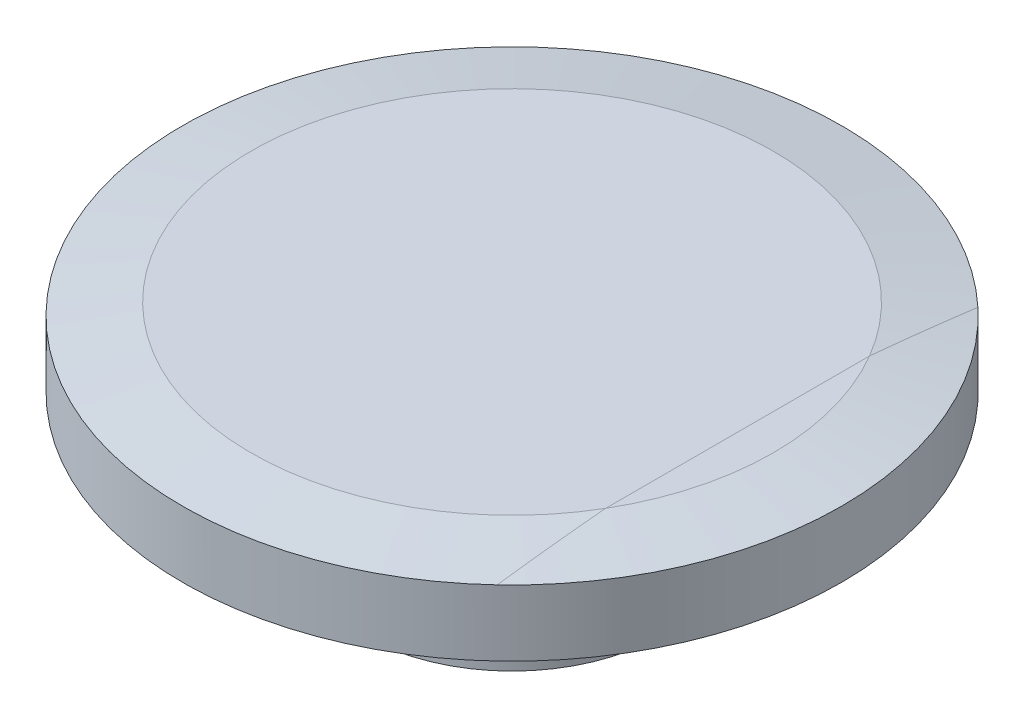
ISO-10303-21;
HEADER;
FILE_DESCRIPTION(('STEP AP214'),'2;1');
FILE_NAME('part.step','',(''),(''),'','','');
FILE_SCHEMA(('AUTOMOTIVE_DESIGN { 1 0 10303 214 1 1 1 1 }'));
ENDSEC;
DATA;
#1=APPLICATION_CONTEXT('core data for automotive mechanical design processes');
#2=APPLICATION_PROTOCOL_DEFINITION('international standard','automotive_design',2000,#1);
#3=PRODUCT_CONTEXT('',#1,'mechanical');
#4=PRODUCT('Part','Part','',(#3));
#5=PRODUCT_RELATED_PRODUCT_CATEGORY('part','',(#4));
#6=PRODUCT_DEFINITION_FORMATION('','',#4);
#7=PRODUCT_DEFINITION_CONTEXT('part definition',#1,'design');
#8=PRODUCT_DEFINITION('design','',#6,#7);
#9=PRODUCT_DEFINITION_SHAPE('','',#8);
#10=(LENGTH_UNIT() NAMED_UNIT(*) SI_UNIT(.MILLI.,.METRE.));
#11=(NAMED_UNIT(*) PLANE_ANGLE_UNIT() SI_UNIT($,.RADIAN.));
#12=(NAMED_UNIT(*) SI_UNIT($,.STERADIAN.) SOLID_ANGLE_UNIT());
#13=UNCERTAINTY_MEASURE_WITH_UNIT(LENGTH_MEASURE(1.E-05),#10,'distance_accuracy_value','');
#14=(GEOMETRIC_REPRESENTATION_CONTEXT(3) GLOBAL_UNCERTAINTY_ASSIGNED_CONTEXT((#13)) GLOBAL_UNIT_ASSIGNED_CONTEXT((#10,
#11,#12)) REPRESENTATION_CONTEXT('',''));
#15=CARTESIAN_POINT('',(0.,0.,0.));
#16=DIRECTION('',(0.,0.,1.));
#17=DIRECTION('',(1.,0.,0.));
#18=AXIS2_PLACEMENT_3D('',#15,#16,#17);
#19=CARTESIAN_POINT('',(0.,4.80540728933231,0.));
#20=DIRECTION('',(0.,-1.,0.));
#21=DIRECTION('',(1.,0.,0.));
#22=AXIS2_PLACEMENT_3D('',#19,#20,#21);
#23=CONICAL_SURFACE('',#22,19.,1.39626340159547);
#24=CARTESIAN_POINT('',(0.,4.80540728933231,0.));
#25=DIRECTION('',(0.,-1.,0.));
#26=DIRECTION('',(1.,0.,0.));
#27=AXIS2_PLACEMENT_3D('',#24,#25,#26);
#28=CIRCLE('',#27,19.);
#29=CARTESIAN_POINT('',(13.,4.80540728933231,13.856406460551));
#30=VERTEX_POINT('',#29);
#31=CARTESIAN_POINT('',(13.,4.80540728933231,-13.856406460551));
#32=VERTEX_POINT('',#31);
#33=EDGE_CURVE('E99',#30,#32,#28,.T.);
#34=ORIENTED_EDGE('',*,*,#33,.F.);
#35=CARTESIAN_POINT('',(13.,2.31121008987516,30.4895161654745));
#36=CARTESIAN_POINT('',(13.,2.41530572681389,29.8476905336172));
#37=CARTESIAN_POINT('',(13.,2.51892307689922,29.2057869232764));
#38=CARTESIAN_POINT('',(13.,2.7249923543946,27.9217911718034));
#39=CARTESIAN_POINT('',(13.,2.8274442790501,27.2796990302292));
#40=CARTESIAN_POINT('',(13.,3.0309776594264,25.9952695608044));
#41=CARTESIAN_POINT('',(13.,3.13205905710125,25.3529322237462));
#42=CARTESIAN_POINT('',(13.,3.33257228938226,24.0680001913044));
#43=CARTESIAN_POINT('',(13.,3.43200412475887,23.4254054960411));
#44=CARTESIAN_POINT('',(13.,3.62949258321327,22.135886040919));
#45=CARTESIAN_POINT('',(13.,3.72753669671665,21.4889593626281));
#46=CARTESIAN_POINT('',(13.,3.92116463128853,20.1947380838925));
#47=CARTESIAN_POINT('',(13.,4.01674845535077,19.5474434838964));
#48=CARTESIAN_POINT('',(13.,4.20488870255473,18.2524125259976));
#49=CARTESIAN_POINT('',(13.,4.29744512140502,17.60467616747));
#50=CARTESIAN_POINT('',(13.,4.47880115270545,16.3086758796796));
#51=CARTESIAN_POINT('',(13.,4.56760076392919,15.6604119502447));
#52=CARTESIAN_POINT('',(13.,4.73921553340661,14.3729191267315));
#53=CARTESIAN_POINT('',(13.,4.82210014398257,13.7336995266951));
#54=CARTESIAN_POINT('',(13.,4.98216288450543,12.4545416986967));
#55=CARTESIAN_POINT('',(13.,5.05934100838971,11.8146034699719));
#56=CARTESIAN_POINT('',(13.,5.20654855000325,10.5338495345427));
#57=CARTESIAN_POINT('',(13.,5.2765774184768,9.89303376424635));
#58=CARTESIAN_POINT('',(13.,5.40770408354041,8.61047919203078));
#59=CARTESIAN_POINT('',(13.,5.46880186787379,7.96874038884602));
#60=CARTESIAN_POINT('',(13.,5.57981104415224,6.68643607556364));
#61=CARTESIAN_POINT('',(13.,5.6297589989125,6.04587377159681));
#62=CARTESIAN_POINT('',(13.,5.71653622670032,4.76386474126163));
#63=CARTESIAN_POINT('',(13.,5.75336587281951,4.12241804056692));
#64=CARTESIAN_POINT('',(13.,5.81188953804813,2.83898342444468));
#65=CARTESIAN_POINT('',(13.,5.83358738757517,2.19699568720111));
#66=CARTESIAN_POINT('',(13.,5.86047721364373,0.912673419967473));
#67=CARTESIAN_POINT('',(13.,5.86566935821499,0.270338893574328));
#68=CARTESIAN_POINT('',(13.,5.85926983447491,-0.998977350105742));
#69=CARTESIAN_POINT('',(13.,5.84807415398916,-1.62596110371076));
#70=CARTESIAN_POINT('',(13.,5.81034202725848,-2.87945760004487));
#71=CARTESIAN_POINT('',(13.,5.78380543290066,-3.50597033816794));
#72=CARTESIAN_POINT('',(13.,5.68345304369718,-5.38469318401634));
#73=CARTESIAN_POINT('',(13.,5.58889721893067,-6.63580943363815));
#74=CARTESIAN_POINT('',(13.,5.41737986608787,-8.51164386407171));
#75=CARTESIAN_POINT('',(13.,5.35513167163209,-9.13782352486299));
#76=CARTESIAN_POINT('',(13.,5.22260595965362,-10.3893424884137));
#77=CARTESIAN_POINT('',(13.,5.15232845285552,-11.0146817922944));
#78=CARTESIAN_POINT('',(13.,5.00532255772142,-12.264532290718));
#79=CARTESIAN_POINT('',(13.,4.92859477672202,-12.8890435576143));
#80=CARTESIAN_POINT('',(13.,4.76996254968886,-14.137405838054));
#81=CARTESIAN_POINT('',(13.,4.68805810816821,-14.7612568521726));
#82=CARTESIAN_POINT('',(13.,4.51884903433383,-16.017605324806));
#83=CARTESIAN_POINT('',(13.,4.43148251406547,-16.6500944133672));
#84=CARTESIAN_POINT('',(13.,4.25330033589122,-17.9145851118954));
#85=CARTESIAN_POINT('',(13.,4.16248467888602,-18.5465867219897));
#86=CARTESIAN_POINT('',(13.,3.9780548832446,-19.8101874123));
#87=CARTESIAN_POINT('',(13.,3.88444071511186,-20.4417864882017));
#88=CARTESIAN_POINT('',(13.,3.69492504435202,-21.704641526758));
#89=CARTESIAN_POINT('',(13.,3.59902353927255,-22.3358974890441));
#90=CARTESIAN_POINT('',(13.,3.40591084898618,-23.5943666770609));
#91=CARTESIAN_POINT('',(13.,3.3087108434296,-24.2215816204942));
#92=CARTESIAN_POINT('',(13.,3.11275957106311,-25.4757691975206));
#93=CARTESIAN_POINT('',(13.,3.01400830358431,-26.1027418310091));
#94=CARTESIAN_POINT('',(13.,2.81521143747229,-27.3564498902704));
#95=CARTESIAN_POINT('',(13.,2.71516590306829,-27.9831853262378));
#96=CARTESIAN_POINT('',(13.,2.51396907830428,-29.2364773597436));
#97=CARTESIAN_POINT('',(13.,2.41281779032627,-29.8630339576643));
#98=CARTESIAN_POINT('',(13.,2.31121008987516,-30.4895161654745));
#99=B_SPLINE_CURVE_WITH_KNOTS('',3,(#35,#36,#37,#38,#39,#40,#41,#42,#43,#44,#45,#46,#47,#48,#49,
#50,#51,#52,#53,#54,#55,#56,#57,#58,#59,#60,#61,#62,#63,#64,#65,#66,#67,#68,#69,#70,#71,#72,#73,
#74,#75,#76,#77,#78,#79,#80,#81,#82,#83,#84,#85,#86,#87,#88,#89,#90,#91,#92,#93,#94,#95,#96,#97,
#98),.UNSPECIFIED.,.F.,.F.,(4,2,2,2,2,2,2,2,2,2,2,2,2,2,2,2,2,2,2,2,2,2,2,2,2,2,2,2,2,2,2,4),
(0.,1.95063733751736,3.90127928453466,5.85200359067993,7.80272698570069,9.76566507352978,
11.7286007726886,13.6915392542314,15.6544783765623,17.5881706616603,19.5218650010976,
21.4557077888106,23.3895532304317,25.3169608260723,27.2443136008445,29.1711783140514,
31.0980234115189,32.9790708706674,34.8601364911848,38.6231024232312,40.5108799595391,
42.3986549744106,44.2862524412546,46.1738482624777,48.0893205989275,50.0047924351898,
51.9202844677934,53.8357785541836,55.7398817816886,57.6439858302507,59.5479957455857,
61.4520015601429),.UNSPECIFIED.);
#100=CARTESIAN_POINT('',(13.,5.5,7.60439100181148));
#101=VERTEX_POINT('',#100);
#102=EDGE_CURVE('E12',#30,#101,#99,.T.);
#103=ORIENTED_EDGE('',*,*,#102,.T.);
#104=CARTESIAN_POINT('',(0.,5.5,0.));
#105=DIRECTION('',(0.,-1.,0.));
#106=DIRECTION('',(1.,0.,0.));
#107=AXIS2_PLACEMENT_3D('',#104,#105,#106);
#108=CIRCLE('',#107,15.0607689879512);
#109=CARTESIAN_POINT('',(13.,5.5,-7.60439100181148));
#110=VERTEX_POINT('',#109);
#111=EDGE_CURVE('E97',#101,#110,#108,.T.);
#112=ORIENTED_EDGE('',*,*,#111,.T.);
#113=EDGE_CURVE('E79',#110,#32,#99,.T.);
#114=ORIENTED_EDGE('',*,*,#113,.T.);
#115=EDGE_LOOP('',(#34,#103,#112,#114));
#116=FACE_BOUND('',#115,.T.);
#117=ADVANCED_FACE('F68',(#116),#23,.T.);
#118=CARTESIAN_POINT('',(0.,5.5,0.));
#119=DIRECTION('',(0.,-1.,0.));
#120=DIRECTION('',(1.,0.,0.));
#121=AXIS2_PLACEMENT_3D('',#118,#119,#120);
#122=PLANE('',#121);
#123=DIRECTION('',(0.,0.,1.));
#124=VECTOR('',#123,1.);
#125=CARTESIAN_POINT('',(13.,5.5,0.));
#126=LINE('',#125,#124);
#127=EDGE_CURVE('E72',#110,#101,#126,.T.);
#128=ORIENTED_EDGE('',*,*,#127,.F.);
#129=ORIENTED_EDGE('',*,*,#111,.F.);
#130=EDGE_LOOP('',(#128,#129));
#131=FACE_BOUND('',#130,.T.);
#132=ADVANCED_FACE('F111',(#131),#122,.F.);
#133=EDGE_CURVE('E104',#110,#101,#108,.T.);
#134=ORIENTED_EDGE('',*,*,#133,.F.);
#135=ORIENTED_EDGE('',*,*,#127,.T.);
#136=EDGE_LOOP('',(#134,#135));
#137=FACE_BOUND('',#136,.T.);
#138=ADVANCED_FACE('F103',(#137),#122,.F.);
#139=ORIENTED_EDGE('',*,*,#102,.F.);
#140=EDGE_CURVE('E113',#32,#30,#28,.T.);
#141=ORIENTED_EDGE('',*,*,#140,.F.);
#142=ORIENTED_EDGE('',*,*,#113,.F.);
#143=ORIENTED_EDGE('',*,*,#133,.T.);
#144=EDGE_LOOP('',(#139,#141,#142,#143));
#145=FACE_BOUND('',#144,.T.);
#146=ADVANCED_FACE('F107',(#145),#23,.T.);
#147=CARTESIAN_POINT('',(0.,-1.6,0.));
#148=DIRECTION('',(0.,-1.,0.));
#149=DIRECTION('',(1.,0.,0.));
#150=AXIS2_PLACEMENT_3D('',#147,#148,#149);
#151=CYLINDRICAL_SURFACE('',#150,19.);
#152=ORIENTED_EDGE('',*,*,#33,.T.);
#153=ORIENTED_EDGE('',*,*,#140,.T.);
#154=EDGE_LOOP('',(#152,#153));
#155=FACE_BOUND('',#154,.T.);
#156=CARTESIAN_POINT('',(0.,0.999999999999999,0.));
#157=DIRECTION('',(0.,-1.,0.));
#158=DIRECTION('',(1.,0.,0.));
#159=AXIS2_PLACEMENT_3D('',#156,#157,#158);
#160=CIRCLE('',#159,19.);
#161=CARTESIAN_POINT('',(19.,0.999999999999999,0.));
#162=VERTEX_POINT('',#161);
#163=EDGE_CURVE('E211',#162,#162,#160,.F.);
#164=ORIENTED_EDGE('',*,*,#163,.T.);
#165=EDGE_LOOP('',(#164));
#166=FACE_BOUND('',#165,.T.);
#167=ADVANCED_FACE('F130',(#155,#166),#151,.T.);
#168=CARTESIAN_POINT('',(0.,3.4,0.));
#169=DIRECTION('',(0.,1.,0.));
#170=DIRECTION('',(-1.,0.,0.));
#171=AXIS2_PLACEMENT_3D('',#168,#169,#170);
#172=PLANE('',#171);
#173=CARTESIAN_POINT('',(0.,3.4,0.));
#174=DIRECTION('',(0.,-1.,0.));
#175=DIRECTION('',(1.,0.,0.));
#176=AXIS2_PLACEMENT_3D('',#173,#174,#175);
#177=CIRCLE('',#176,5.6);
#178=CARTESIAN_POINT('',(5.6,3.4,0.));
#179=VERTEX_POINT('',#178);
#180=EDGE_CURVE('E234',#179,#179,#177,.T.);
#181=ORIENTED_EDGE('',*,*,#180,.T.);
#182=EDGE_LOOP('',(#181));
#183=FACE_BOUND('',#182,.T.);
#184=ADVANCED_FACE('F139',(#183),#172,.F.);
#185=CARTESIAN_POINT('',(0.,-1.6,0.));
#186=DIRECTION('',(0.,-1.,0.));
#187=DIRECTION('',(1.,0.,0.));
#188=AXIS2_PLACEMENT_3D('',#185,#186,#187);
#189=CYLINDRICAL_SURFACE('',#188,5.6);
#190=ORIENTED_EDGE('',*,*,#180,.F.);
#191=EDGE_LOOP('',(#190));
#192=FACE_BOUND('',#191,.T.);
#193=CARTESIAN_POINT('',(0.,-6.85,0.));
#194=DIRECTION('',(0.,1.,0.));
#195=DIRECTION('',(-1.,0.,0.));
#196=AXIS2_PLACEMENT_3D('',#193,#194,#195);
#197=CIRCLE('',#196,5.6);
#198=CARTESIAN_POINT('',(-5.6,-6.85,0.));
#199=VERTEX_POINT('',#198);
#200=EDGE_CURVE('E237',#199,#199,#197,.T.);
#201=ORIENTED_EDGE('',*,*,#200,.F.);
#202=EDGE_LOOP('',(#201));
#203=FACE_BOUND('',#202,.T.);
#204=ADVANCED_FACE('F145',(#192,#203),#189,.F.);
#205=CARTESIAN_POINT('',(0.,-6.85,0.));
#206=DIRECTION('',(0.,1.,0.));
#207=DIRECTION('',(-1.,0.,0.));
#208=AXIS2_PLACEMENT_3D('',#205,#206,#207);
#209=PLANE('',#208);
#210=CARTESIAN_POINT('',(0.,-6.85,0.));
#211=DIRECTION('',(0.,1.,0.));
#212=DIRECTION('',(-1.,0.,0.));
#213=AXIS2_PLACEMENT_3D('',#210,#211,#212);
#214=CIRCLE('',#213,8.6);
#215=CARTESIAN_POINT('',(-8.6,-6.85,0.));
#216=VERTEX_POINT('',#215);
#217=EDGE_CURVE('E117',#216,#216,#214,.T.);
#218=ORIENTED_EDGE('',*,*,#217,.F.);
#219=EDGE_LOOP('',(#218));
#220=FACE_BOUND('',#219,.T.);
#221=ORIENTED_EDGE('',*,*,#200,.T.);
#222=EDGE_LOOP('',(#221));
#223=FACE_BOUND('',#222,.T.);
#224=ADVANCED_FACE('F149',(#220,#223),#209,.F.);
#225=CARTESIAN_POINT('',(0.,-1.6,0.));
#226=DIRECTION('',(0.,-1.,0.));
#227=DIRECTION('',(1.,0.,0.));
#228=AXIS2_PLACEMENT_3D('',#225,#226,#227);
#229=CYLINDRICAL_SURFACE('',#228,8.6);
#230=CARTESIAN_POINT('',(0.,-0.350000000000001,0.));
#231=DIRECTION('',(0.,-1.,0.));
#232=DIRECTION('',(1.,0.,0.));
#233=AXIS2_PLACEMENT_3D('',#230,#231,#232);
#234=CIRCLE('',#233,8.6);
#235=CARTESIAN_POINT('',(8.6,-0.350000000000001,0.));
#236=VERTEX_POINT('',#235);
#237=EDGE_CURVE('E230',#236,#236,#234,.T.);
#238=ORIENTED_EDGE('',*,*,#237,.T.);
#239=EDGE_LOOP('',(#238));
#240=FACE_BOUND('',#239,.T.);
#241=ORIENTED_EDGE('',*,*,#217,.T.);
#242=EDGE_LOOP('',(#241));
#243=FACE_BOUND('',#242,.T.);
#244=ADVANCED_FACE('F153',(#240,#243),#229,.T.);
#245=CARTESIAN_POINT('',(0.,-0.350000000000001,0.));
#246=DIRECTION('',(0.,1.,0.));
#247=DIRECTION('',(-1.,0.,0.));
#248=AXIS2_PLACEMENT_3D('',#245,#246,#247);
#249=PLANE('',#248);
#250=ORIENTED_EDGE('',*,*,#237,.F.);
#251=EDGE_LOOP('',(#250));
#252=FACE_BOUND('',#251,.T.);
#253=CARTESIAN_POINT('',(0.,-0.350000000000001,0.));
#254=DIRECTION('',(0.,-1.,0.));
#255=DIRECTION('',(1.,0.,0.));
#256=AXIS2_PLACEMENT_3D('',#253,#254,#255);
#257=CIRCLE('',#256,10.35);
#258=CARTESIAN_POINT('',(10.35,-0.350000000000001,0.));
#259=VERTEX_POINT('',#258);
#260=EDGE_CURVE('E226',#259,#259,#257,.T.);
#261=ORIENTED_EDGE('',*,*,#260,.T.);
#262=EDGE_LOOP('',(#261));
#263=FACE_BOUND('',#262,.T.);
#264=ADVANCED_FACE('F157',(#252,#263),#249,.F.);
#265=CARTESIAN_POINT('',(0.,-1.6,0.));
#266=DIRECTION('',(0.,-1.,0.));
#267=DIRECTION('',(1.,0.,0.));
#268=AXIS2_PLACEMENT_3D('',#265,#266,#267);
#269=CYLINDRICAL_SURFACE('',#268,10.35);
#270=ORIENTED_EDGE('',*,*,#260,.F.);
#271=EDGE_LOOP('',(#270));
#272=FACE_BOUND('',#271,.T.);
#273=CARTESIAN_POINT('',(0.,0.,0.));
#274=DIRECTION('',(0.,-1.,0.));
#275=DIRECTION('',(1.,0.,0.));
#276=AXIS2_PLACEMENT_3D('',#273,#274,#275);
#277=CIRCLE('',#276,10.35);
#278=CARTESIAN_POINT('',(10.35,0.,0.));
#279=VERTEX_POINT('',#278);
#280=EDGE_CURVE('E222',#279,#279,#277,.T.);
#281=ORIENTED_EDGE('',*,*,#280,.T.);
#282=EDGE_LOOP('',(#281));
#283=FACE_BOUND('',#282,.T.);
#284=ADVANCED_FACE('F161',(#272,#283),#269,.T.);
#285=CARTESIAN_POINT('',(0.,0.,0.));
#286=DIRECTION('',(0.,-1.,0.));
#287=DIRECTION('',(1.,0.,0.));
#288=AXIS2_PLACEMENT_3D('',#285,#286,#287);
#289=PLANE('',#288);
#290=CARTESIAN_POINT('',(0.,0.,0.));
#291=DIRECTION('',(0.,-1.,0.));
#292=DIRECTION('',(1.,0.,0.));
#293=AXIS2_PLACEMENT_3D('',#290,#291,#292);
#294=CIRCLE('',#293,10.8556535720254);
#295=CARTESIAN_POINT('',(10.8556535720254,0.,0.));
#296=VERTEX_POINT('',#295);
#297=EDGE_CURVE('E218',#296,#296,#294,.T.);
#298=ORIENTED_EDGE('',*,*,#297,.T.);
#299=EDGE_LOOP('',(#298));
#300=FACE_BOUND('',#299,.T.);
#301=ORIENTED_EDGE('',*,*,#280,.F.);
#302=EDGE_LOOP('',(#301));
#303=FACE_BOUND('',#302,.T.);
#304=ADVANCED_FACE('F165',(#300,#303),#289,.T.);
#305=CARTESIAN_POINT('',(0.,0.,0.));
#306=DIRECTION('',(0.,1.,0.));
#307=DIRECTION('',(-1.,0.,0.));
#308=AXIS2_PLACEMENT_3D('',#305,#306,#307);
#309=CONICAL_SURFACE('',#308,10.8556535720254,1.44862327915529);
#310=ORIENTED_EDGE('',*,*,#163,.F.);
#311=EDGE_LOOP('',(#310));
#312=FACE_BOUND('',#311,.T.);
#313=ORIENTED_EDGE('',*,*,#297,.F.);
#314=EDGE_LOOP('',(#313));
#315=FACE_BOUND('',#314,.T.);
#316=ADVANCED_FACE('F169',(#312,#315),#309,.T.);
#317=CLOSED_SHELL('',(#117,#132,#138,#146,#167,#184,#204,#224,#244,#264,#284,#304,#316));
#318=CARTESIAN_POINT('',(0.,1.2,0.));
#319=DIRECTION('',(0.,-1.,0.));
#320=DIRECTION('',(1.,0.,0.));
#321=AXIS2_PLACEMENT_3D('',#318,#319,#320);
#322=PLANE('',#321);
#323=CARTESIAN_POINT('',(0.,1.2,0.));
#324=DIRECTION('',(0.,-1.,0.));
#325=DIRECTION('',(1.,0.,0.));
#326=AXIS2_PLACEMENT_3D('',#323,#324,#325);
#327=CIRCLE('',#326,10.7822584278448);
#328=CARTESIAN_POINT('',(10.7822584278448,1.2,0.));
#329=VERTEX_POINT('',#328);
#330=EDGE_CURVE('E207',#329,#329,#327,.T.);
#331=ORIENTED_EDGE('',*,*,#330,.F.);
#332=EDGE_LOOP('',(#331));
#333=FACE_BOUND('',#332,.T.);
#334=CARTESIAN_POINT('',(0.,1.2,0.));
#335=DIRECTION('',(0.,-1.,0.));
#336=DIRECTION('',(1.,0.,0.));
#337=AXIS2_PLACEMENT_3D('',#334,#335,#336);
#338=CIRCLE('',#337,7.15);
#339=CARTESIAN_POINT('',(7.15,1.2,0.));
#340=VERTEX_POINT('',#339);
#341=EDGE_CURVE('E195',#340,#340,#338,.T.);
#342=ORIENTED_EDGE('',*,*,#341,.T.);
#343=EDGE_LOOP('',(#342));
#344=FACE_BOUND('',#343,.T.);
#345=ADVANCED_FACE('F185',(#333,#344),#322,.F.);
#346=CARTESIAN_POINT('',(0.,-1.6,0.));
#347=DIRECTION('',(0.,-1.,0.));
#348=DIRECTION('',(1.,0.,0.));
#349=AXIS2_PLACEMENT_3D('',#346,#347,#348);
#350=CYLINDRICAL_SURFACE('',#349,7.15);
#351=ORIENTED_EDGE('',*,*,#341,.F.);
#352=EDGE_LOOP('',(#351));
#353=FACE_BOUND('',#352,.T.);
#354=CARTESIAN_POINT('',(0.,4.3,0.));
#355=DIRECTION('',(0.,1.,0.));
#356=DIRECTION('',(-1.,0.,0.));
#357=AXIS2_PLACEMENT_3D('',#354,#355,#356);
#358=CIRCLE('',#357,7.15);
#359=CARTESIAN_POINT('',(-7.15,4.3,0.));
#360=VERTEX_POINT('',#359);
#361=EDGE_CURVE('E109',#360,#360,#358,.F.);
#362=ORIENTED_EDGE('',*,*,#361,.T.);
#363=EDGE_LOOP('',(#362));
#364=FACE_BOUND('',#363,.T.);
#365=ADVANCED_FACE('F183',(#353,#364),#350,.T.);
#366=CARTESIAN_POINT('',(0.,1.19105538196959,0.));
#367=DIRECTION('',(0.,1.,0.));
#368=DIRECTION('',(-1.,0.,0.));
#369=AXIS2_PLACEMENT_3D('',#366,#367,#368);
#370=CONICAL_SURFACE('',#369,10.7094103599392,1.44862327915529);
#371=CARTESIAN_POINT('',(0.,2.06167031746713,0.));
#372=DIRECTION('',(0.,1.,0.));
#373=DIRECTION('',(-1.,0.,0.));
#374=AXIS2_PLACEMENT_3D('',#371,#372,#373);
#375=CIRCLE('',#374,17.8);
#376=CARTESIAN_POINT('',(-17.8,2.06167031746713,0.));
#377=VERTEX_POINT('',#376);
#378=EDGE_CURVE('E204',#377,#377,#375,.T.);
#379=ORIENTED_EDGE('',*,*,#378,.T.);
#380=EDGE_LOOP('',(#379));
#381=FACE_BOUND('',#380,.T.);
#382=ORIENTED_EDGE('',*,*,#330,.T.);
#383=EDGE_LOOP('',(#382));
#384=FACE_BOUND('',#383,.T.);
#385=ADVANCED_FACE('F179',(#381,#384),#370,.F.);
#386=CARTESIAN_POINT('',(0.,-1.6,0.));
#387=DIRECTION('',(0.,-1.,0.));
#388=DIRECTION('',(1.,0.,0.));
#389=AXIS2_PLACEMENT_3D('',#386,#387,#388);
#390=CYLINDRICAL_SURFACE('',#389,17.8);
#391=ORIENTED_EDGE('',*,*,#378,.F.);
#392=EDGE_LOOP('',(#391));
#393=FACE_BOUND('',#392,.T.);
#394=CARTESIAN_POINT('',(0.,4.3,0.));
#395=DIRECTION('',(0.,1.,0.));
#396=DIRECTION('',(-1.,0.,0.));
#397=AXIS2_PLACEMENT_3D('',#394,#395,#396);
#398=CIRCLE('',#397,17.8);
#399=CARTESIAN_POINT('',(-17.8,4.3,0.));
#400=VERTEX_POINT('',#399);
#401=EDGE_CURVE('E200',#400,#400,#398,.F.);
#402=ORIENTED_EDGE('',*,*,#401,.F.);
#403=EDGE_LOOP('',(#402));
#404=FACE_BOUND('',#403,.T.);
#405=ADVANCED_FACE('F134',(#393,#404),#390,.F.);
#406=CARTESIAN_POINT('',(0.,4.3,0.));
#407=DIRECTION('',(0.,1.,0.));
#408=DIRECTION('',(-1.,0.,0.));
#409=AXIS2_PLACEMENT_3D('',#406,#407,#408);
#410=PLANE('',#409);
#411=ORIENTED_EDGE('',*,*,#401,.T.);
#412=EDGE_LOOP('',(#411));
#413=FACE_BOUND('',#412,.T.);
#414=ORIENTED_EDGE('',*,*,#361,.F.);
#415=EDGE_LOOP('',(#414));
#416=FACE_BOUND('',#415,.T.);
#417=ADVANCED_FACE('F131',(#413,#416),#410,.F.);
#418=CLOSED_SHELL('',(#345,#365,#385,#405,#417));
#419=ORIENTED_CLOSED_SHELL('',*,#418,.T.);
#420=BREP_WITH_VOIDS('B2',#317,(#419));
#421=CARTESIAN_POINT('',(0.,4.3,0.));
#422=DIRECTION('',(0.,1.,0.));
#423=DIRECTION('',(-1.,0.,0.));
#424=AXIS2_PLACEMENT_3D('',#421,#422,#423);
#425=PLANE('',#424);
#426=CARTESIAN_POINT('',(0.,4.3,0.));
#427=DIRECTION('',(0.,1.,0.));
#428=DIRECTION('',(-1.,0.,0.));
#429=AXIS2_PLACEMENT_3D('',#426,#427,#428);
#430=CIRCLE('',#429,7.15);
#431=CARTESIAN_POINT('',(-7.15,4.3,0.));
#432=VERTEX_POINT('',#431);
#433=EDGE_CURVE('E66',#432,#432,#430,.F.);
#434=ORIENTED_EDGE('',*,*,#433,.T.);
#435=EDGE_LOOP('',(#434));
#436=FACE_BOUND('',#435,.T.);
#437=CARTESIAN_POINT('',(0.,4.3,0.));
#438=DIRECTION('',(0.,1.,0.));
#439=DIRECTION('',(-1.,0.,0.));
#440=AXIS2_PLACEMENT_3D('',#437,#438,#439);
#441=CIRCLE('',#440,17.8);
#442=CARTESIAN_POINT('',(-17.8,4.3,0.));
#443=VERTEX_POINT('',#442);
#444=EDGE_CURVE('E503',#443,#443,#441,.F.);
#445=ORIENTED_EDGE('',*,*,#444,.F.);
#446=EDGE_LOOP('',(#445));
#447=FACE_BOUND('',#446,.T.);
#448=ADVANCED_FACE('F488',(#436,#447),#425,.T.);
#449=CARTESIAN_POINT('',(0.,-1.6,0.));
#450=DIRECTION('',(0.,-1.,0.));
#451=DIRECTION('',(1.,0.,0.));
#452=AXIS2_PLACEMENT_3D('',#449,#450,#451);
#453=CYLINDRICAL_SURFACE('',#452,7.15);
#454=CARTESIAN_POINT('',(0.,1.2,0.));
#455=DIRECTION('',(0.,-1.,0.));
#456=DIRECTION('',(1.,0.,0.));
#457=AXIS2_PLACEMENT_3D('',#454,#455,#456);
#458=CIRCLE('',#457,7.15);
#459=CARTESIAN_POINT('',(7.15,1.2,0.));
#460=VERTEX_POINT('',#459);
#461=EDGE_CURVE('E506',#460,#460,#458,.T.);
#462=ORIENTED_EDGE('',*,*,#461,.T.);
#463=EDGE_LOOP('',(#462));
#464=FACE_BOUND('',#463,.T.);
#465=ORIENTED_EDGE('',*,*,#433,.F.);
#466=EDGE_LOOP('',(#465));
#467=FACE_BOUND('',#466,.T.);
#468=ADVANCED_FACE('F514',(#464,#467),#453,.F.);
#469=CARTESIAN_POINT('',(0.,1.2,0.));
#470=DIRECTION('',(0.,-1.,0.));
#471=DIRECTION('',(1.,0.,0.));
#472=AXIS2_PLACEMENT_3D('',#469,#470,#471);
#473=PLANE('',#472);
#474=CARTESIAN_POINT('',(0.,1.2,0.));
#475=DIRECTION('',(0.,-1.,0.));
#476=DIRECTION('',(1.,0.,0.));
#477=AXIS2_PLACEMENT_3D('',#474,#475,#476);
#478=CIRCLE('',#477,10.7822584278448);
#479=CARTESIAN_POINT('',(10.7822584278448,1.2,0.));
#480=VERTEX_POINT('',#479);
#481=EDGE_CURVE('E494',#480,#480,#478,.T.);
#482=ORIENTED_EDGE('',*,*,#481,.T.);
#483=EDGE_LOOP('',(#482));
#484=FACE_BOUND('',#483,.T.);
#485=ORIENTED_EDGE('',*,*,#461,.F.);
#486=EDGE_LOOP('',(#485));
#487=FACE_BOUND('',#486,.T.);
#488=ADVANCED_FACE('F518',(#484,#487),#473,.T.);
#489=CARTESIAN_POINT('',(0.,-1.6,0.));
#490=DIRECTION('',(0.,-1.,0.));
#491=DIRECTION('',(1.,0.,0.));
#492=AXIS2_PLACEMENT_3D('',#489,#490,#491);
#493=CYLINDRICAL_SURFACE('',#492,17.8);
#494=CARTESIAN_POINT('',(0.,2.06167031746713,0.));
#495=DIRECTION('',(0.,1.,0.));
#496=DIRECTION('',(-1.,0.,0.));
#497=AXIS2_PLACEMENT_3D('',#494,#495,#496);
#498=CIRCLE('',#497,17.8);
#499=CARTESIAN_POINT('',(-17.8,2.06167031746713,0.));
#500=VERTEX_POINT('',#499);
#501=EDGE_CURVE('E498',#500,#500,#498,.T.);
#502=ORIENTED_EDGE('',*,*,#501,.T.);
#503=EDGE_LOOP('',(#502));
#504=FACE_BOUND('',#503,.T.);
#505=ORIENTED_EDGE('',*,*,#444,.T.);
#506=EDGE_LOOP('',(#505));
#507=FACE_BOUND('',#506,.T.);
#508=ADVANCED_FACE('F511',(#504,#507),#493,.T.);
#509=CARTESIAN_POINT('',(0.,1.19105538196959,0.));
#510=DIRECTION('',(0.,1.,0.));
#511=DIRECTION('',(-1.,0.,0.));
#512=AXIS2_PLACEMENT_3D('',#509,#510,#511);
#513=CONICAL_SURFACE('',#512,10.7094103599392,1.44862327915529);
#514=ORIENTED_EDGE('',*,*,#501,.F.);
#515=EDGE_LOOP('',(#514));
#516=FACE_BOUND('',#515,.T.);
#517=ORIENTED_EDGE('',*,*,#481,.F.);
#518=EDGE_LOOP('',(#517));
#519=FACE_BOUND('',#518,.T.);
#520=ADVANCED_FACE('F525',(#516,#519),#513,.T.);
#521=CLOSED_SHELL('',(#448,#468,#488,#508,#520));
#522=MANIFOLD_SOLID_BREP('B6',#521);
#523=ADVANCED_BREP_SHAPE_REPRESENTATION('',(#18,#420,#522),#14);
#524=SHAPE_DEFINITION_REPRESENTATION(#9,#523);
ENDSEC;
END-ISO-10303-21;
